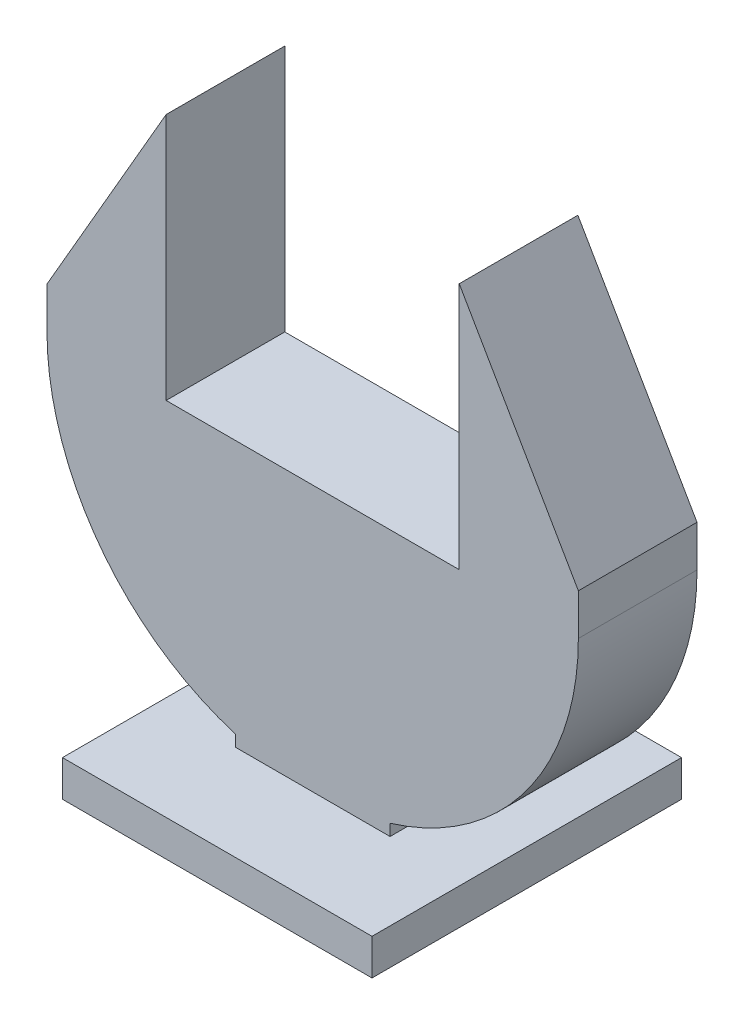
ISO-10303-21;
HEADER;
FILE_DESCRIPTION(('STEP AP214'),'2;1');
FILE_NAME('part.step','',(''),(''),'','','');
FILE_SCHEMA(('AUTOMOTIVE_DESIGN { 1 0 10303 214 1 1 1 1 }'));
ENDSEC;
DATA;
#1=APPLICATION_CONTEXT('core data for automotive mechanical design processes');
#2=APPLICATION_PROTOCOL_DEFINITION('international standard','automotive_design',2000,#1);
#3=PRODUCT_CONTEXT('',#1,'mechanical');
#4=PRODUCT('Part','Part','',(#3));
#5=PRODUCT_RELATED_PRODUCT_CATEGORY('part','',(#4));
#6=PRODUCT_DEFINITION_FORMATION('','',#4);
#7=PRODUCT_DEFINITION_CONTEXT('part definition',#1,'design');
#8=PRODUCT_DEFINITION('design','',#6,#7);
#9=PRODUCT_DEFINITION_SHAPE('','',#8);
#10=(LENGTH_UNIT() NAMED_UNIT(*) SI_UNIT(.MILLI.,.METRE.));
#11=(NAMED_UNIT(*) PLANE_ANGLE_UNIT() SI_UNIT($,.RADIAN.));
#12=(NAMED_UNIT(*) SI_UNIT($,.STERADIAN.) SOLID_ANGLE_UNIT());
#13=UNCERTAINTY_MEASURE_WITH_UNIT(LENGTH_MEASURE(1.E-05),#10,'distance_accuracy_value','');
#14=(GEOMETRIC_REPRESENTATION_CONTEXT(3) GLOBAL_UNCERTAINTY_ASSIGNED_CONTEXT((#13)) GLOBAL_UNIT_ASSIGNED_CONTEXT((#10,
#11,#12)) REPRESENTATION_CONTEXT('',''));
#15=CARTESIAN_POINT('',(0.,0.,0.));
#16=DIRECTION('',(0.,0.,1.));
#17=DIRECTION('',(1.,0.,0.));
#18=AXIS2_PLACEMENT_3D('',#15,#16,#17);
#19=CARTESIAN_POINT('',(30.,7.,30.));
#20=DIRECTION('',(-1.,0.,0.));
#21=DIRECTION('',(0.,0.,1.));
#22=AXIS2_PLACEMENT_3D('',#19,#20,#21);
#23=PLANE('',#22);
#24=DIRECTION('',(0.,0.,-1.));
#25=VECTOR('',#24,1.);
#26=CARTESIAN_POINT('',(30.,0.,30.));
#27=LINE('',#26,#25);
#28=CARTESIAN_POINT('',(30.,0.,30.));
#29=VERTEX_POINT('',#28);
#30=CARTESIAN_POINT('',(30.,0.,-30.));
#31=VERTEX_POINT('',#30);
#32=EDGE_CURVE('E244',#29,#31,#27,.T.);
#33=ORIENTED_EDGE('',*,*,#32,.T.);
#34=DIRECTION('',(0.,-1.,0.));
#35=VECTOR('',#34,1.);
#36=CARTESIAN_POINT('',(30.,7.,-30.));
#37=LINE('',#36,#35);
#38=CARTESIAN_POINT('',(30.,7.,-30.));
#39=VERTEX_POINT('',#38);
#40=EDGE_CURVE('E11',#39,#31,#37,.T.);
#41=ORIENTED_EDGE('',*,*,#40,.F.);
#42=DIRECTION('',(0.,0.,-1.));
#43=VECTOR('',#42,1.);
#44=CARTESIAN_POINT('',(30.,7.,30.));
#45=LINE('',#44,#43);
#46=CARTESIAN_POINT('',(30.,7.,30.));
#47=VERTEX_POINT('',#46);
#48=EDGE_CURVE('E265',#47,#39,#45,.T.);
#49=ORIENTED_EDGE('',*,*,#48,.F.);
#50=DIRECTION('',(0.,-1.,0.));
#51=VECTOR('',#50,1.);
#52=CARTESIAN_POINT('',(30.,7.,30.));
#53=LINE('',#52,#51);
#54=EDGE_CURVE('E271',#47,#29,#53,.T.);
#55=ORIENTED_EDGE('',*,*,#54,.T.);
#56=EDGE_LOOP('',(#33,#41,#49,#55));
#57=FACE_BOUND('',#56,.T.);
#58=ADVANCED_FACE('F39',(#57),#23,.F.);
#59=CARTESIAN_POINT('',(-30.,7.,-30.));
#60=DIRECTION('',(0.,0.,1.));
#61=DIRECTION('',(1.,0.,0.));
#62=AXIS2_PLACEMENT_3D('',#59,#60,#61);
#63=PLANE('',#62);
#64=DIRECTION('',(-1.,0.,0.));
#65=VECTOR('',#64,1.);
#66=CARTESIAN_POINT('',(-30.,0.,-30.));
#67=LINE('',#66,#65);
#68=CARTESIAN_POINT('',(-30.,0.,-30.));
#69=VERTEX_POINT('',#68);
#70=EDGE_CURVE('E274',#31,#69,#67,.T.);
#71=ORIENTED_EDGE('',*,*,#70,.T.);
#72=DIRECTION('',(0.,-1.,0.));
#73=VECTOR('',#72,1.);
#74=CARTESIAN_POINT('',(-30.,7.,-30.));
#75=LINE('',#74,#73);
#76=CARTESIAN_POINT('',(-30.,7.,-30.));
#77=VERTEX_POINT('',#76);
#78=EDGE_CURVE('E46',#77,#69,#75,.T.);
#79=ORIENTED_EDGE('',*,*,#78,.F.);
#80=DIRECTION('',(-1.,0.,0.));
#81=VECTOR('',#80,1.);
#82=CARTESIAN_POINT('',(-30.,7.,-30.));
#83=LINE('',#82,#81);
#84=EDGE_CURVE('E90',#39,#77,#83,.T.);
#85=ORIENTED_EDGE('',*,*,#84,.F.);
#86=ORIENTED_EDGE('',*,*,#40,.T.);
#87=EDGE_LOOP('',(#71,#79,#85,#86));
#88=FACE_BOUND('',#87,.T.);
#89=ADVANCED_FACE('F304',(#88),#63,.F.);
#90=CARTESIAN_POINT('',(-30.,7.,30.));
#91=DIRECTION('',(1.,0.,0.));
#92=DIRECTION('',(0.,0.,-1.));
#93=AXIS2_PLACEMENT_3D('',#90,#91,#92);
#94=PLANE('',#93);
#95=DIRECTION('',(0.,0.,1.));
#96=VECTOR('',#95,1.);
#97=CARTESIAN_POINT('',(-30.,0.,30.));
#98=LINE('',#97,#96);
#99=CARTESIAN_POINT('',(-30.,0.,30.));
#100=VERTEX_POINT('',#99);
#101=EDGE_CURVE('E276',#69,#100,#98,.T.);
#102=ORIENTED_EDGE('',*,*,#101,.T.);
#103=DIRECTION('',(0.,-1.,0.));
#104=VECTOR('',#103,1.);
#105=CARTESIAN_POINT('',(-30.,7.,30.));
#106=LINE('',#105,#104);
#107=CARTESIAN_POINT('',(-30.,7.,30.));
#108=VERTEX_POINT('',#107);
#109=EDGE_CURVE('E280',#108,#100,#106,.T.);
#110=ORIENTED_EDGE('',*,*,#109,.F.);
#111=DIRECTION('',(0.,0.,1.));
#112=VECTOR('',#111,1.);
#113=CARTESIAN_POINT('',(-30.,7.,30.));
#114=LINE('',#113,#112);
#115=EDGE_CURVE('E268',#77,#108,#114,.T.);
#116=ORIENTED_EDGE('',*,*,#115,.F.);
#117=ORIENTED_EDGE('',*,*,#78,.T.);
#118=EDGE_LOOP('',(#102,#110,#116,#117));
#119=FACE_BOUND('',#118,.T.);
#120=ADVANCED_FACE('F285',(#119),#94,.F.);
#121=CARTESIAN_POINT('',(-30.,7.,30.));
#122=DIRECTION('',(0.,0.,-1.));
#123=DIRECTION('',(-1.,0.,0.));
#124=AXIS2_PLACEMENT_3D('',#121,#122,#123);
#125=PLANE('',#124);
#126=DIRECTION('',(1.,0.,0.));
#127=VECTOR('',#126,1.);
#128=CARTESIAN_POINT('',(-30.,0.,30.));
#129=LINE('',#128,#127);
#130=EDGE_CURVE('E83',#100,#29,#129,.T.);
#131=ORIENTED_EDGE('',*,*,#130,.T.);
#132=ORIENTED_EDGE('',*,*,#54,.F.);
#133=DIRECTION('',(1.,0.,0.));
#134=VECTOR('',#133,1.);
#135=CARTESIAN_POINT('',(-30.,7.,30.));
#136=LINE('',#135,#134);
#137=EDGE_CURVE('E62',#108,#47,#136,.T.);
#138=ORIENTED_EDGE('',*,*,#137,.F.);
#139=ORIENTED_EDGE('',*,*,#109,.T.);
#140=EDGE_LOOP('',(#131,#132,#138,#139));
#141=FACE_BOUND('',#140,.T.);
#142=ADVANCED_FACE('F293',(#141),#125,.F.);
#143=CARTESIAN_POINT('',(0.,7.,0.));
#144=DIRECTION('',(0.,-1.,0.));
#145=DIRECTION('',(0.,0.,-1.));
#146=AXIS2_PLACEMENT_3D('',#143,#144,#145);
#147=PLANE('',#146);
#148=DIRECTION('',(1.,0.,0.));
#149=VECTOR('',#148,1.);
#150=CARTESIAN_POINT('',(-15.,7.,-11.5));
#151=LINE('',#150,#149);
#152=CARTESIAN_POINT('',(-15.,7.,-11.5));
#153=VERTEX_POINT('',#152);
#154=CARTESIAN_POINT('',(15.,7.,-11.5));
#155=VERTEX_POINT('',#154);
#156=EDGE_CURVE('E223',#153,#155,#151,.T.);
#157=ORIENTED_EDGE('',*,*,#156,.T.);
#158=DIRECTION('',(0.,0.,1.));
#159=VECTOR('',#158,1.);
#160=CARTESIAN_POINT('',(15.,7.,-11.5));
#161=LINE('',#160,#159);
#162=CARTESIAN_POINT('',(15.,7.,11.5));
#163=VERTEX_POINT('',#162);
#164=EDGE_CURVE('E257',#155,#163,#161,.T.);
#165=ORIENTED_EDGE('',*,*,#164,.T.);
#166=DIRECTION('',(1.,0.,0.));
#167=VECTOR('',#166,1.);
#168=CARTESIAN_POINT('',(-15.,7.,11.5));
#169=LINE('',#168,#167);
#170=CARTESIAN_POINT('',(-15.,7.,11.5));
#171=VERTEX_POINT('',#170);
#172=EDGE_CURVE('E194',#171,#163,#169,.T.);
#173=ORIENTED_EDGE('',*,*,#172,.F.);
#174=DIRECTION('',(0.,0.,1.));
#175=VECTOR('',#174,1.);
#176=CARTESIAN_POINT('',(-15.,7.,-11.5));
#177=LINE('',#176,#175);
#178=EDGE_CURVE('E260',#153,#171,#177,.T.);
#179=ORIENTED_EDGE('',*,*,#178,.F.);
#180=EDGE_LOOP('',(#157,#165,#173,#179));
#181=FACE_BOUND('',#180,.T.);
#182=ORIENTED_EDGE('',*,*,#48,.T.);
#183=ORIENTED_EDGE('',*,*,#84,.T.);
#184=ORIENTED_EDGE('',*,*,#115,.T.);
#185=ORIENTED_EDGE('',*,*,#137,.T.);
#186=EDGE_LOOP('',(#182,#183,#184,#185));
#187=FACE_BOUND('',#186,.T.);
#188=ADVANCED_FACE('F295',(#181,#187),#147,.F.);
#189=CARTESIAN_POINT('',(0.,0.,0.));
#190=DIRECTION('',(0.,-1.,0.));
#191=DIRECTION('',(0.,0.,-1.));
#192=AXIS2_PLACEMENT_3D('',#189,#190,#191);
#193=PLANE('',#192);
#194=ORIENTED_EDGE('',*,*,#32,.F.);
#195=ORIENTED_EDGE('',*,*,#130,.F.);
#196=ORIENTED_EDGE('',*,*,#101,.F.);
#197=ORIENTED_EDGE('',*,*,#70,.F.);
#198=EDGE_LOOP('',(#194,#195,#196,#197));
#199=FACE_BOUND('',#198,.T.);
#200=ADVANCED_FACE('F289',(#199),#193,.T.);
#201=CARTESIAN_POINT('',(-51.5,66.5,-11.5));
#202=DIRECTION('',(-0.866025403784436,0.500000000000004,0.));
#203=DIRECTION('',(-0.500000000000004,-0.866025403784436,0.));
#204=AXIS2_PLACEMENT_3D('',#201,#202,#203);
#205=PLANE('',#204);
#206=DIRECTION('',(0.,0.,1.));
#207=VECTOR('',#206,1.);
#208=CARTESIAN_POINT('',(-51.5,66.5,-11.5));
#209=LINE('',#208,#207);
#210=CARTESIAN_POINT('',(-51.5,66.5,-11.5));
#211=VERTEX_POINT('',#210);
#212=CARTESIAN_POINT('',(-51.5,66.5,11.5));
#213=VERTEX_POINT('',#212);
#214=EDGE_CURVE('E161',#211,#213,#209,.T.);
#215=ORIENTED_EDGE('',*,*,#214,.T.);
#216=DIRECTION('',(-0.500000000000004,-0.866025403784436,0.));
#217=VECTOR('',#216,1.);
#218=CARTESIAN_POINT('',(-51.5,66.5,11.5));
#219=LINE('',#218,#217);
#220=CARTESIAN_POINT('',(-28.4059892324147,106.5,11.5));
#221=VERTEX_POINT('',#220);
#222=EDGE_CURVE('E166',#221,#213,#219,.T.);
#223=ORIENTED_EDGE('',*,*,#222,.F.);
#224=DIRECTION('',(0.,0.,1.));
#225=VECTOR('',#224,1.);
#226=CARTESIAN_POINT('',(-28.4059892324147,106.5,-11.5));
#227=LINE('',#226,#225);
#228=CARTESIAN_POINT('',(-28.4059892324147,106.5,-11.5));
#229=VERTEX_POINT('',#228);
#230=EDGE_CURVE('E242',#229,#221,#227,.T.);
#231=ORIENTED_EDGE('',*,*,#230,.F.);
#232=DIRECTION('',(-0.500000000000004,-0.866025403784436,0.));
#233=VECTOR('',#232,1.);
#234=CARTESIAN_POINT('',(-51.5,66.5,-11.5));
#235=LINE('',#234,#233);
#236=EDGE_CURVE('E168',#229,#211,#235,.T.);
#237=ORIENTED_EDGE('',*,*,#236,.T.);
#238=EDGE_LOOP('',(#215,#223,#231,#237));
#239=FACE_BOUND('',#238,.T.);
#240=ADVANCED_FACE('F163',(#239),#205,.T.);
#241=CARTESIAN_POINT('',(-28.4059892324147,106.5,-11.5));
#242=DIRECTION('',(1.,0.,0.));
#243=DIRECTION('',(0.,1.,0.));
#244=AXIS2_PLACEMENT_3D('',#241,#242,#243);
#245=PLANE('',#244);
#246=ORIENTED_EDGE('',*,*,#230,.T.);
#247=DIRECTION('',(0.,1.,0.));
#248=VECTOR('',#247,1.);
#249=CARTESIAN_POINT('',(-28.4059892324147,66.5,11.5));
#250=LINE('',#249,#248);
#251=CARTESIAN_POINT('',(-28.4059892324147,58.5,11.5));
#252=VERTEX_POINT('',#251);
#253=EDGE_CURVE('E187',#252,#221,#250,.T.);
#254=ORIENTED_EDGE('',*,*,#253,.F.);
#255=DIRECTION('',(0.,0.,1.));
#256=VECTOR('',#255,1.);
#257=CARTESIAN_POINT('',(-28.4059892324147,58.5,-11.5));
#258=LINE('',#257,#256);
#259=CARTESIAN_POINT('',(-28.4059892324147,58.5,-11.5));
#260=VERTEX_POINT('',#259);
#261=EDGE_CURVE('E245',#260,#252,#258,.T.);
#262=ORIENTED_EDGE('',*,*,#261,.F.);
#263=DIRECTION('',(0.,1.,0.));
#264=VECTOR('',#263,1.);
#265=CARTESIAN_POINT('',(-28.4059892324147,66.5,-11.5));
#266=LINE('',#265,#264);
#267=EDGE_CURVE('E173',#260,#229,#266,.T.);
#268=ORIENTED_EDGE('',*,*,#267,.T.);
#269=EDGE_LOOP('',(#246,#254,#262,#268));
#270=FACE_BOUND('',#269,.T.);
#271=ADVANCED_FACE('F340',(#270),#245,.T.);
#272=CARTESIAN_POINT('',(-28.4059892324147,58.5,-11.5));
#273=DIRECTION('',(0.,1.,0.));
#274=DIRECTION('',(0.,0.,1.));
#275=AXIS2_PLACEMENT_3D('',#272,#273,#274);
#276=PLANE('',#275);
#277=ORIENTED_EDGE('',*,*,#261,.T.);
#278=DIRECTION('',(-1.,0.,0.));
#279=VECTOR('',#278,1.);
#280=CARTESIAN_POINT('',(-28.4059892324147,58.5,11.5));
#281=LINE('',#280,#279);
#282=CARTESIAN_POINT('',(28.4059892324143,58.5,11.5));
#283=VERTEX_POINT('',#282);
#284=EDGE_CURVE('E211',#283,#252,#281,.T.);
#285=ORIENTED_EDGE('',*,*,#284,.F.);
#286=DIRECTION('',(0.,0.,1.));
#287=VECTOR('',#286,1.);
#288=CARTESIAN_POINT('',(28.4059892324143,58.5,-11.5));
#289=LINE('',#288,#287);
#290=CARTESIAN_POINT('',(28.4059892324143,58.5,-11.5));
#291=VERTEX_POINT('',#290);
#292=EDGE_CURVE('E247',#291,#283,#289,.T.);
#293=ORIENTED_EDGE('',*,*,#292,.F.);
#294=DIRECTION('',(-1.,0.,0.));
#295=VECTOR('',#294,1.);
#296=CARTESIAN_POINT('',(-28.4059892324147,58.5,-11.5));
#297=LINE('',#296,#295);
#298=EDGE_CURVE('E238',#291,#260,#297,.T.);
#299=ORIENTED_EDGE('',*,*,#298,.T.);
#300=EDGE_LOOP('',(#277,#285,#293,#299));
#301=FACE_BOUND('',#300,.T.);
#302=ADVANCED_FACE('F350',(#301),#276,.T.);
#303=CARTESIAN_POINT('',(28.4059892324143,66.5,-11.5));
#304=DIRECTION('',(-1.,0.,0.));
#305=DIRECTION('',(0.,-1.,0.));
#306=AXIS2_PLACEMENT_3D('',#303,#304,#305);
#307=PLANE('',#306);
#308=ORIENTED_EDGE('',*,*,#292,.T.);
#309=DIRECTION('',(0.,-1.,0.));
#310=VECTOR('',#309,1.);
#311=CARTESIAN_POINT('',(28.405989232414,106.5,11.5));
#312=LINE('',#311,#310);
#313=CARTESIAN_POINT('',(28.405989232414,106.5,11.5));
#314=VERTEX_POINT('',#313);
#315=EDGE_CURVE('E208',#314,#283,#312,.T.);
#316=ORIENTED_EDGE('',*,*,#315,.F.);
#317=DIRECTION('',(0.,0.,1.));
#318=VECTOR('',#317,1.);
#319=CARTESIAN_POINT('',(28.405989232414,106.5,-11.5));
#320=LINE('',#319,#318);
#321=CARTESIAN_POINT('',(28.405989232414,106.5,-11.5));
#322=VERTEX_POINT('',#321);
#323=EDGE_CURVE('E249',#322,#314,#320,.T.);
#324=ORIENTED_EDGE('',*,*,#323,.F.);
#325=DIRECTION('',(0.,-1.,0.));
#326=VECTOR('',#325,1.);
#327=CARTESIAN_POINT('',(28.405989232414,106.5,-11.5));
#328=LINE('',#327,#326);
#329=EDGE_CURVE('E236',#322,#291,#328,.T.);
#330=ORIENTED_EDGE('',*,*,#329,.T.);
#331=EDGE_LOOP('',(#308,#316,#324,#330));
#332=FACE_BOUND('',#331,.T.);
#333=ADVANCED_FACE('F360',(#332),#307,.T.);
#334=CARTESIAN_POINT('',(51.4999999999995,66.5000000000005,-11.5));
#335=DIRECTION('',(0.866025403784431,0.500000000000012,0.));
#336=DIRECTION('',(-0.500000000000012,0.866025403784432,0.));
#337=AXIS2_PLACEMENT_3D('',#334,#335,#336);
#338=PLANE('',#337);
#339=ORIENTED_EDGE('',*,*,#323,.T.);
#340=DIRECTION('',(-0.500000000000012,0.866025403784431,0.));
#341=VECTOR('',#340,1.);
#342=CARTESIAN_POINT('',(51.4999999999995,66.5000000000005,11.5));
#343=LINE('',#342,#341);
#344=CARTESIAN_POINT('',(51.4999999999995,66.5000000000005,11.5));
#345=VERTEX_POINT('',#344);
#346=EDGE_CURVE('E205',#345,#314,#343,.T.);
#347=ORIENTED_EDGE('',*,*,#346,.F.);
#348=DIRECTION('',(0.,0.,1.));
#349=VECTOR('',#348,1.);
#350=CARTESIAN_POINT('',(51.4999999999995,66.5000000000005,-11.5));
#351=LINE('',#350,#349);
#352=CARTESIAN_POINT('',(51.4999999999995,66.5000000000005,-11.5));
#353=VERTEX_POINT('',#352);
#354=EDGE_CURVE('E251',#353,#345,#351,.T.);
#355=ORIENTED_EDGE('',*,*,#354,.F.);
#356=DIRECTION('',(-0.500000000000012,0.866025403784431,0.));
#357=VECTOR('',#356,1.);
#358=CARTESIAN_POINT('',(51.4999999999995,66.5000000000005,-11.5));
#359=LINE('',#358,#357);
#360=EDGE_CURVE('E233',#353,#322,#359,.T.);
#361=ORIENTED_EDGE('',*,*,#360,.T.);
#362=EDGE_LOOP('',(#339,#347,#355,#361));
#363=FACE_BOUND('',#362,.T.);
#364=ADVANCED_FACE('F371',(#363),#338,.T.);
#365=CARTESIAN_POINT('',(51.5,58.5,-11.5));
#366=DIRECTION('',(1.,0.,0.));
#367=DIRECTION('',(0.,1.,0.));
#368=AXIS2_PLACEMENT_3D('',#365,#366,#367);
#369=PLANE('',#368);
#370=ORIENTED_EDGE('',*,*,#354,.T.);
#371=DIRECTION('',(0.,1.,0.));
#372=VECTOR('',#371,1.);
#373=CARTESIAN_POINT('',(51.5,58.5,11.5));
#374=LINE('',#373,#372);
#375=CARTESIAN_POINT('',(51.5,58.5,11.5));
#376=VERTEX_POINT('',#375);
#377=EDGE_CURVE('E202',#376,#345,#374,.T.);
#378=ORIENTED_EDGE('',*,*,#377,.F.);
#379=DIRECTION('',(0.,0.,1.));
#380=VECTOR('',#379,1.);
#381=CARTESIAN_POINT('',(51.5,58.5,-11.5));
#382=LINE('',#381,#380);
#383=CARTESIAN_POINT('',(51.5,58.5,-11.5));
#384=VERTEX_POINT('',#383);
#385=EDGE_CURVE('E253',#384,#376,#382,.T.);
#386=ORIENTED_EDGE('',*,*,#385,.F.);
#387=DIRECTION('',(0.,1.,0.));
#388=VECTOR('',#387,1.);
#389=CARTESIAN_POINT('',(51.5,58.5,-11.5));
#390=LINE('',#389,#388);
#391=EDGE_CURVE('E230',#384,#353,#390,.T.);
#392=ORIENTED_EDGE('',*,*,#391,.T.);
#393=EDGE_LOOP('',(#370,#378,#386,#392));
#394=FACE_BOUND('',#393,.T.);
#395=ADVANCED_FACE('F381',(#394),#369,.T.);
#396=CARTESIAN_POINT('',(0.,58.5,-11.5));
#397=DIRECTION('',(0.,0.,1.));
#398=DIRECTION('',(1.,0.,0.));
#399=AXIS2_PLACEMENT_3D('',#396,#397,#398);
#400=CYLINDRICAL_SURFACE('',#399,51.5);
#401=ORIENTED_EDGE('',*,*,#385,.T.);
#402=CARTESIAN_POINT('',(0.,58.5,11.5));
#403=DIRECTION('',(0.,0.,1.));
#404=DIRECTION('',(1.,0.,0.));
#405=AXIS2_PLACEMENT_3D('',#402,#403,#404);
#406=CIRCLE('',#405,51.5);
#407=CARTESIAN_POINT('',(15.,9.23287099901192,11.5));
#408=VERTEX_POINT('',#407);
#409=EDGE_CURVE('E199',#408,#376,#406,.T.);
#410=ORIENTED_EDGE('',*,*,#409,.F.);
#411=DIRECTION('',(0.,0.,1.));
#412=VECTOR('',#411,1.);
#413=CARTESIAN_POINT('',(15.,9.23287099901192,-11.5));
#414=LINE('',#413,#412);
#415=CARTESIAN_POINT('',(15.,9.23287099901192,-11.5));
#416=VERTEX_POINT('',#415);
#417=EDGE_CURVE('E255',#416,#408,#414,.T.);
#418=ORIENTED_EDGE('',*,*,#417,.F.);
#419=CARTESIAN_POINT('',(0.,58.5,-11.5));
#420=DIRECTION('',(0.,0.,1.));
#421=DIRECTION('',(1.,0.,0.));
#422=AXIS2_PLACEMENT_3D('',#419,#420,#421);
#423=CIRCLE('',#422,51.5);
#424=EDGE_CURVE('E227',#416,#384,#423,.T.);
#425=ORIENTED_EDGE('',*,*,#424,.T.);
#426=EDGE_LOOP('',(#401,#410,#418,#425));
#427=FACE_BOUND('',#426,.T.);
#428=ADVANCED_FACE('F391',(#427),#400,.T.);
#429=CARTESIAN_POINT('',(15.,7.,-11.5));
#430=DIRECTION('',(1.,0.,0.));
#431=DIRECTION('',(0.,1.,0.));
#432=AXIS2_PLACEMENT_3D('',#429,#430,#431);
#433=PLANE('',#432);
#434=ORIENTED_EDGE('',*,*,#417,.T.);
#435=DIRECTION('',(0.,1.,0.));
#436=VECTOR('',#435,1.);
#437=CARTESIAN_POINT('',(15.,7.,11.5));
#438=LINE('',#437,#436);
#439=EDGE_CURVE('E196',#163,#408,#438,.T.);
#440=ORIENTED_EDGE('',*,*,#439,.F.);
#441=ORIENTED_EDGE('',*,*,#164,.F.);
#442=DIRECTION('',(0.,1.,0.));
#443=VECTOR('',#442,1.);
#444=CARTESIAN_POINT('',(15.,7.,-11.5));
#445=LINE('',#444,#443);
#446=EDGE_CURVE('E53',#155,#416,#445,.T.);
#447=ORIENTED_EDGE('',*,*,#446,.T.);
#448=EDGE_LOOP('',(#434,#440,#441,#447));
#449=FACE_BOUND('',#448,.T.);
#450=ADVANCED_FACE('F401',(#449),#433,.T.);
#451=CARTESIAN_POINT('',(-15.,7.,-11.5));
#452=DIRECTION('',(-1.,0.,0.));
#453=DIRECTION('',(0.,0.,1.));
#454=AXIS2_PLACEMENT_3D('',#451,#452,#453);
#455=PLANE('',#454);
#456=ORIENTED_EDGE('',*,*,#178,.T.);
#457=DIRECTION('',(0.,-1.,0.));
#458=VECTOR('',#457,1.);
#459=CARTESIAN_POINT('',(-15.,7.,11.5));
#460=LINE('',#459,#458);
#461=CARTESIAN_POINT('',(-15.,9.23287099901192,11.5));
#462=VERTEX_POINT('',#461);
#463=EDGE_CURVE('E191',#462,#171,#460,.T.);
#464=ORIENTED_EDGE('',*,*,#463,.F.);
#465=DIRECTION('',(0.,0.,1.));
#466=VECTOR('',#465,1.);
#467=CARTESIAN_POINT('',(-15.,9.23287099901192,-11.5));
#468=LINE('',#467,#466);
#469=CARTESIAN_POINT('',(-15.,9.23287099901192,-11.5));
#470=VERTEX_POINT('',#469);
#471=EDGE_CURVE('E262',#470,#462,#468,.T.);
#472=ORIENTED_EDGE('',*,*,#471,.F.);
#473=DIRECTION('',(0.,-1.,0.));
#474=VECTOR('',#473,1.);
#475=CARTESIAN_POINT('',(-15.,7.,-11.5));
#476=LINE('',#475,#474);
#477=EDGE_CURVE('E220',#470,#153,#476,.T.);
#478=ORIENTED_EDGE('',*,*,#477,.T.);
#479=EDGE_LOOP('',(#456,#464,#472,#478));
#480=FACE_BOUND('',#479,.T.);
#481=ADVANCED_FACE('F411',(#480),#455,.T.);
#482=CARTESIAN_POINT('',(0.,58.5,-11.5));
#483=DIRECTION('',(0.,0.,1.));
#484=DIRECTION('',(1.,0.,0.));
#485=AXIS2_PLACEMENT_3D('',#482,#483,#484);
#486=CYLINDRICAL_SURFACE('',#485,51.5);
#487=ORIENTED_EDGE('',*,*,#471,.T.);
#488=CARTESIAN_POINT('',(0.,58.5,11.5));
#489=DIRECTION('',(0.,0.,1.));
#490=DIRECTION('',(1.,0.,0.));
#491=AXIS2_PLACEMENT_3D('',#488,#489,#490);
#492=CIRCLE('',#491,51.5);
#493=CARTESIAN_POINT('',(-51.5,58.5,11.5));
#494=VERTEX_POINT('',#493);
#495=EDGE_CURVE('E181',#494,#462,#492,.T.);
#496=ORIENTED_EDGE('',*,*,#495,.F.);
#497=DIRECTION('',(0.,0.,1.));
#498=VECTOR('',#497,1.);
#499=CARTESIAN_POINT('',(-51.5,58.5,-11.5));
#500=LINE('',#499,#498);
#501=CARTESIAN_POINT('',(-51.5,58.5,-11.5));
#502=VERTEX_POINT('',#501);
#503=EDGE_CURVE('E172',#502,#494,#500,.T.);
#504=ORIENTED_EDGE('',*,*,#503,.F.);
#505=CARTESIAN_POINT('',(0.,58.5,-11.5));
#506=DIRECTION('',(0.,0.,1.));
#507=DIRECTION('',(1.,0.,0.));
#508=AXIS2_PLACEMENT_3D('',#505,#506,#507);
#509=CIRCLE('',#508,51.5);
#510=EDGE_CURVE('E217',#502,#470,#509,.T.);
#511=ORIENTED_EDGE('',*,*,#510,.T.);
#512=EDGE_LOOP('',(#487,#496,#504,#511));
#513=FACE_BOUND('',#512,.T.);
#514=ADVANCED_FACE('F421',(#513),#486,.T.);
#515=CARTESIAN_POINT('',(-51.5,58.5,-11.5));
#516=DIRECTION('',(-1.,0.,0.));
#517=DIRECTION('',(0.,0.,1.));
#518=AXIS2_PLACEMENT_3D('',#515,#516,#517);
#519=PLANE('',#518);
#520=ORIENTED_EDGE('',*,*,#503,.T.);
#521=DIRECTION('',(0.,-1.,0.));
#522=VECTOR('',#521,1.);
#523=CARTESIAN_POINT('',(-51.5,58.5,11.5));
#524=LINE('',#523,#522);
#525=EDGE_CURVE('E176',#213,#494,#524,.T.);
#526=ORIENTED_EDGE('',*,*,#525,.F.);
#527=ORIENTED_EDGE('',*,*,#214,.F.);
#528=DIRECTION('',(0.,-1.,0.));
#529=VECTOR('',#528,1.);
#530=CARTESIAN_POINT('',(-51.5,58.5,-11.5));
#531=LINE('',#530,#529);
#532=EDGE_CURVE('E215',#211,#502,#531,.T.);
#533=ORIENTED_EDGE('',*,*,#532,.T.);
#534=EDGE_LOOP('',(#520,#526,#527,#533));
#535=FACE_BOUND('',#534,.T.);
#536=ADVANCED_FACE('F177',(#535),#519,.T.);
#537=CARTESIAN_POINT('',(0.,58.5,-11.5));
#538=DIRECTION('',(0.,0.,1.));
#539=DIRECTION('',(1.,0.,0.));
#540=AXIS2_PLACEMENT_3D('',#537,#538,#539);
#541=PLANE('',#540);
#542=ORIENTED_EDGE('',*,*,#236,.F.);
#543=ORIENTED_EDGE('',*,*,#267,.F.);
#544=ORIENTED_EDGE('',*,*,#298,.F.);
#545=ORIENTED_EDGE('',*,*,#329,.F.);
#546=ORIENTED_EDGE('',*,*,#360,.F.);
#547=ORIENTED_EDGE('',*,*,#391,.F.);
#548=ORIENTED_EDGE('',*,*,#424,.F.);
#549=ORIENTED_EDGE('',*,*,#446,.F.);
#550=ORIENTED_EDGE('',*,*,#156,.F.);
#551=ORIENTED_EDGE('',*,*,#477,.F.);
#552=ORIENTED_EDGE('',*,*,#510,.F.);
#553=ORIENTED_EDGE('',*,*,#532,.F.);
#554=EDGE_LOOP('',(#542,#543,#544,#545,#546,#547,#548,#549,#550,#551,#552,#553));
#555=FACE_BOUND('',#554,.T.);
#556=ADVANCED_FACE('F440',(#555),#541,.F.);
#557=CARTESIAN_POINT('',(0.,58.5,11.5));
#558=DIRECTION('',(0.,0.,1.));
#559=DIRECTION('',(1.,0.,0.));
#560=AXIS2_PLACEMENT_3D('',#557,#558,#559);
#561=PLANE('',#560);
#562=ORIENTED_EDGE('',*,*,#222,.T.);
#563=ORIENTED_EDGE('',*,*,#525,.T.);
#564=ORIENTED_EDGE('',*,*,#495,.T.);
#565=ORIENTED_EDGE('',*,*,#463,.T.);
#566=ORIENTED_EDGE('',*,*,#172,.T.);
#567=ORIENTED_EDGE('',*,*,#439,.T.);
#568=ORIENTED_EDGE('',*,*,#409,.T.);
#569=ORIENTED_EDGE('',*,*,#377,.T.);
#570=ORIENTED_EDGE('',*,*,#346,.T.);
#571=ORIENTED_EDGE('',*,*,#315,.T.);
#572=ORIENTED_EDGE('',*,*,#284,.T.);
#573=ORIENTED_EDGE('',*,*,#253,.T.);
#574=EDGE_LOOP('',(#562,#563,#564,#565,#566,#567,#568,#569,#570,#571,#572,#573));
#575=FACE_BOUND('',#574,.T.);
#576=ADVANCED_FACE('F184',(#575),#561,.T.);
#577=CLOSED_SHELL('',(#58,#89,#120,#142,#188,#200,#240,#271,#302,#333,#364,#395,#428,#450,#481,
#514,#536,#556,#576));
#578=MANIFOLD_SOLID_BREP('B2',#577);
#579=ADVANCED_BREP_SHAPE_REPRESENTATION('',(#18,#578),#14);
#580=SHAPE_DEFINITION_REPRESENTATION(#9,#579);
ENDSEC;
END-ISO-10303-21;
